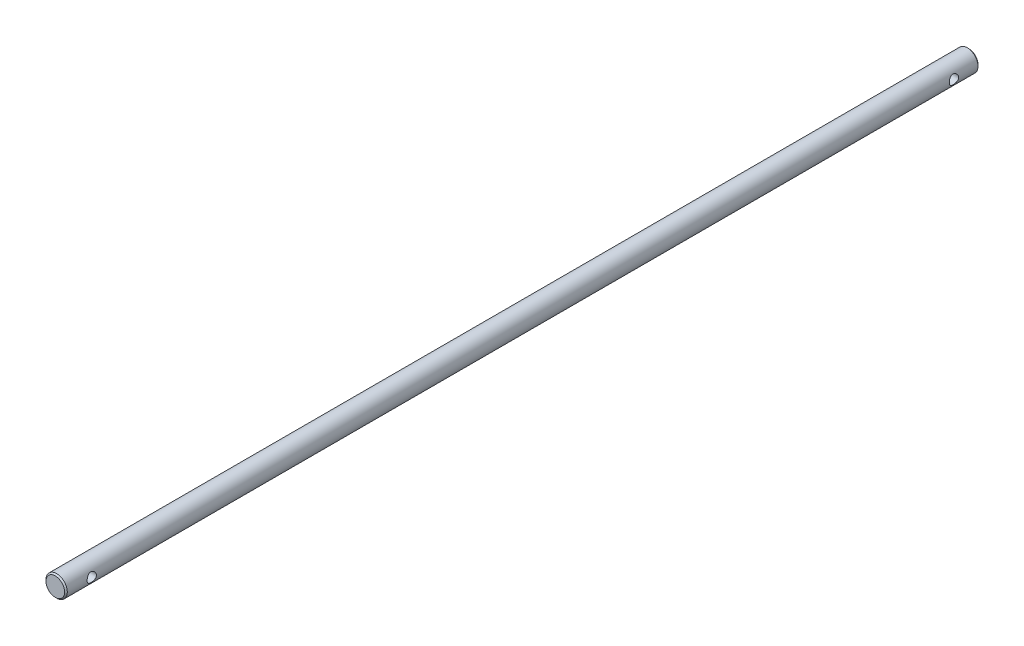
ISO-10303-21;
HEADER;
FILE_DESCRIPTION(('STEP AP214'),'2;1');
FILE_NAME('part.step','',(''),(''),'','','');
FILE_SCHEMA(('AUTOMOTIVE_DESIGN { 1 0 10303 214 1 1 1 1 }'));
ENDSEC;
DATA;
#1=APPLICATION_CONTEXT('core data for automotive mechanical design processes');
#2=APPLICATION_PROTOCOL_DEFINITION('international standard','automotive_design',2000,#1);
#3=PRODUCT_CONTEXT('',#1,'mechanical');
#4=PRODUCT('Part','Part','',(#3));
#5=PRODUCT_RELATED_PRODUCT_CATEGORY('part','',(#4));
#6=PRODUCT_DEFINITION_FORMATION('','',#4);
#7=PRODUCT_DEFINITION_CONTEXT('part definition',#1,'design');
#8=PRODUCT_DEFINITION('design','',#6,#7);
#9=PRODUCT_DEFINITION_SHAPE('','',#8);
#10=(LENGTH_UNIT() NAMED_UNIT(*) SI_UNIT(.MILLI.,.METRE.));
#11=(NAMED_UNIT(*) PLANE_ANGLE_UNIT() SI_UNIT($,.RADIAN.));
#12=(NAMED_UNIT(*) SI_UNIT($,.STERADIAN.) SOLID_ANGLE_UNIT());
#13=UNCERTAINTY_MEASURE_WITH_UNIT(LENGTH_MEASURE(1.E-05),#10,'distance_accuracy_value','');
#14=(GEOMETRIC_REPRESENTATION_CONTEXT(3) GLOBAL_UNCERTAINTY_ASSIGNED_CONTEXT((#13)) GLOBAL_UNIT_ASSIGNED_CONTEXT((#10,
#11,#12)) REPRESENTATION_CONTEXT('',''));
#15=CARTESIAN_POINT('',(0.,0.,0.));
#16=DIRECTION('',(0.,0.,1.));
#17=DIRECTION('',(1.,0.,0.));
#18=AXIS2_PLACEMENT_3D('',#15,#16,#17);
#19=CARTESIAN_POINT('',(0.,0.,342.9));
#20=DIRECTION('',(0.,0.,-1.));
#21=DIRECTION('',(-1.,0.,0.));
#22=AXIS2_PLACEMENT_3D('',#19,#20,#21);
#23=CYLINDRICAL_SURFACE('',#22,4.);
#24=CARTESIAN_POINT('',(4.,0.,334.941599310764));
#25=CARTESIAN_POINT('',(3.99999663734808,0.0934463432264823,334.941595169877));
#26=CARTESIAN_POINT('',(3.99668869061283,0.187042389155383,334.934081671393));
#27=CARTESIAN_POINT('',(3.98378594555563,0.37154938095276,334.90432190137));
#28=CARTESIAN_POINT('',(3.97417572989113,0.462453169260804,334.882039498988));
#29=CARTESIAN_POINT('',(3.94969014231534,0.638614374237538,334.823732767344));
#30=CARTESIAN_POINT('',(3.93483335927543,0.723890480122746,334.787756920114));
#31=CARTESIAN_POINT('',(3.90128118573592,0.887105743590368,334.703297788839));
#32=CARTESIAN_POINT('',(3.88258673598616,0.96504669246684,334.654817569318));
#33=CARTESIAN_POINT('',(3.84206972691249,1.11574570191128,334.543952327941));
#34=CARTESIAN_POINT('',(3.82013790368076,1.18805391807246,334.480996175083));
#35=CARTESIAN_POINT('',(3.77606108441152,1.32148009135275,334.344177573686));
#36=CARTESIAN_POINT('',(3.75391597260759,1.38259156357118,334.270308849284));
#37=CARTESIAN_POINT('',(3.71052876905718,1.49526805485836,334.108784222429));
#38=CARTESIAN_POINT('',(3.68940576522506,1.54611132769735,334.020589411492));
#39=CARTESIAN_POINT('',(3.65221182204704,1.6320408373189,333.83584617932));
#40=CARTESIAN_POINT('',(3.63613801387077,1.66713602665513,333.7393025416));
#41=CARTESIAN_POINT('',(3.6120577262251,1.71866664712584,333.545777046626));
#42=CARTESIAN_POINT('',(3.6036775125555,1.7359720830201,333.449075272899));
#43=CARTESIAN_POINT('',(3.59487244260311,1.75413945226084,333.253805679326));
#44=CARTESIAN_POINT('',(3.59444249946225,1.75501190000817,333.155239093075));
#45=CARTESIAN_POINT('',(3.60127372422886,1.74093881994997,332.968151684668));
#46=CARTESIAN_POINT('',(3.60787303256936,1.72735459831769,332.879499215632));
#47=CARTESIAN_POINT('',(3.62689055317553,1.68705543535527,332.70588905813));
#48=CARTESIAN_POINT('',(3.63931002569882,1.66033765011383,332.620932174238));
#49=CARTESIAN_POINT('',(3.66885532481444,1.59400090719573,332.454871504066));
#50=CARTESIAN_POINT('',(3.68607958480637,1.55410850482798,332.373895260988));
#51=CARTESIAN_POINT('',(3.72327669274238,1.46275071446545,332.21945003373));
#52=CARTESIAN_POINT('',(3.74325068159699,1.4112805169919,332.14598418791));
#53=CARTESIAN_POINT('',(3.78598682885878,1.29253409635271,332.001345426591));
#54=CARTESIAN_POINT('',(3.80883420348057,1.22422450595306,331.931043505931));
#55=CARTESIAN_POINT('',(3.85316789206075,1.07658489233751,331.802583138393));
#56=CARTESIAN_POINT('',(3.87465381580334,0.997251730188553,331.744428162173));
#57=CARTESIAN_POINT('',(3.91459288460572,0.82693055449578,331.640446139492));
#58=CARTESIAN_POINT('',(3.93294439394639,0.735678618728522,331.595009401124));
#59=CARTESIAN_POINT('',(3.96374936010267,0.545815738180422,331.520444313078));
#60=CARTESIAN_POINT('',(3.97620642863549,0.44720934271231,331.491305974838));
#61=CARTESIAN_POINT('',(3.99312207438418,0.252683762576196,331.452071017538));
#62=CARTESIAN_POINT('',(3.99806968465928,0.157042481856274,331.440807750357));
#63=CARTESIAN_POINT('',(4.00099761403254,-0.0348853773968451,331.434120120132));
#64=CARTESIAN_POINT('',(3.99898021161985,-0.13117173461826,331.438690577347));
#65=CARTESIAN_POINT('',(3.98851661420575,-0.315953726230852,331.462738791353));
#66=CARTESIAN_POINT('',(3.98043748431965,-0.404583359318488,331.481365723894));
#67=CARTESIAN_POINT('',(3.95907260211437,-0.577343109087928,331.531778153142));
#68=CARTESIAN_POINT('',(3.94578621082902,-0.661472672140376,331.563565264719));
#69=CARTESIAN_POINT('',(3.9147450623497,-0.825825233617224,331.640416979861));
#70=CARTESIAN_POINT('',(3.89686366362399,-0.905844044277323,331.685865401152));
#71=CARTESIAN_POINT('',(3.85849837602854,-1.05740826822764,331.788330988097));
#72=CARTESIAN_POINT('',(3.83801336265467,-1.12894999430306,331.845353158857));
#73=CARTESIAN_POINT('',(3.79463393052205,-1.26744844879856,331.974569524829));
#74=CARTESIAN_POINT('',(3.77167663119023,-1.33360392711709,332.04760352374));
#75=CARTESIAN_POINT('',(3.72732047159778,-1.45297865142874,332.204040335604));
#76=CARTESIAN_POINT('',(3.70592211633901,-1.5061937184614,332.287446485018));
#77=CARTESIAN_POINT('',(3.66679970660888,-1.59912019030095,332.464681088915));
#78=CARTESIAN_POINT('',(3.64916319235882,-1.63852130497262,332.558693051935));
#79=CARTESIAN_POINT('',(3.62067125249862,-1.70056646013738,332.753041072892));
#80=CARTESIAN_POINT('',(3.60980943404431,-1.72322630202965,332.853371070156));
#81=CARTESIAN_POINT('',(3.59714355587648,-1.74950035736323,333.048530196088));
#82=CARTESIAN_POINT('',(3.59466194542807,-1.75454048431464,333.143123825122));
#83=CARTESIAN_POINT('',(3.59720585727819,-1.74931988786869,333.331774405704));
#84=CARTESIAN_POINT('',(3.60222989587907,-1.73906218850748,333.425831459632));
#85=CARTESIAN_POINT('',(3.61857277776088,-1.70477458709946,333.605192844058));
#86=CARTESIAN_POINT('',(3.62951747350146,-1.68156089693572,333.690690767463));
#87=CARTESIAN_POINT('',(3.65613686565626,-1.62286656463062,333.856575229028));
#88=CARTESIAN_POINT('',(3.6718129199857,-1.58738240039692,333.93696029175));
#89=CARTESIAN_POINT('',(3.70735600389641,-1.50258087731124,334.0959053184));
#90=CARTESIAN_POINT('',(3.72742549356056,-1.4525301279185,334.174027748809));
#91=CARTESIAN_POINT('',(3.76899162297866,-1.34098565199573,334.321208845295));
#92=CARTESIAN_POINT('',(3.7904888346813,-1.27948732153591,334.390263845555));
#93=CARTESIAN_POINT('',(3.83465553107366,-1.14067931705401,334.523337256607));
#94=CARTESIAN_POINT('',(3.8572717668694,-1.06247534266936,334.586445099684));
#95=CARTESIAN_POINT('',(3.89935305214483,-0.895781895970826,334.698726654319));
#96=CARTESIAN_POINT('',(3.91881666761382,-0.807287774312666,334.747894032463));
#97=CARTESIAN_POINT('',(3.95220215562429,-0.623468704908329,334.830005291972));
#98=CARTESIAN_POINT('',(3.96619125147993,-0.528244750332977,334.863147229519));
#99=CARTESIAN_POINT('',(3.98731821188224,-0.332968102886718,334.912606496585));
#100=CARTESIAN_POINT('',(3.99447710395941,-0.23293123265386,334.928975475084));
#101=CARTESIAN_POINT('',(3.99854083328223,-0.110288528563413,334.938266103859));
#102=CARTESIAN_POINT('',(3.99908711675265,-0.0882552381577088,334.939514934841));
#103=CARTESIAN_POINT('',(3.99981709907305,-0.0441507512958812,334.941182031385));
#104=CARTESIAN_POINT('',(4.00000079452929,-0.0220795544868966,334.941600289175));
#105=CARTESIAN_POINT('',(4.,0.,334.941599310764));
#106=B_SPLINE_CURVE_WITH_KNOTS('',3,(#24,#25,#26,#27,#28,#29,#30,#31,#32,#33,#34,#35,#36,#37,
#38,#39,#40,#41,#42,#43,#44,#45,#46,#47,#48,#49,#50,#51,#52,#53,#54,#55,#56,#57,#58,#59,#60,#61,
#62,#63,#64,#65,#66,#67,#68,#69,#70,#71,#72,#73,#74,#75,#76,#77,#78,#79,#80,#81,#82,#83,#84,#85,
#86,#87,#88,#89,#90,#91,#92,#93,#94,#95,#96,#97,#98,#99,#100,#101,#102,#103,#104,#105),
.UNSPECIFIED.,.T.,.F.,(4,2,2,2,2,2,2,2,2,2,2,2,2,2,2,2,2,2,2,2,2,2,2,2,2,2,2,2,2,2,2,2,2,2,2,2,
2,2,2,2,4),(0.,0.280248106647614,0.561184359110114,0.841135064053392,1.121017224805,
1.41480376399849,1.70875992350557,2.01909682887037,2.32925708806895,2.62340061325386,
2.91735592872095,3.18589200546284,3.45448625601366,3.72904802807271,4.00372406589868,
4.30432716995196,4.60501604602727,4.91411519083072,5.22302469440982,5.51079411805175,
5.79846941158925,6.07000349898951,6.34157091589477,6.62162332825821,6.90179710923945,
7.20397285238564,7.50624605058368,7.81492927252933,8.12332076754671,8.40609094746911,
8.68880523749623,8.9554451370287,9.22216163596179,9.50575930383601,9.78947127496828,
10.0970191800753,10.4047065868983,10.7084874325425,11.0113300087332,11.0775465690778,
11.1437637491935),.UNSPECIFIED.);
#107=CARTESIAN_POINT('',(4.,0.,334.941599310764));
#108=VERTEX_POINT('',#107);
#109=EDGE_CURVE('E10',#108,#108,#106,.T.);
#110=ORIENTED_EDGE('',*,*,#109,.T.);
#111=EDGE_LOOP('',(#110));
#112=FACE_BOUND('',#111,.T.);
#113=CARTESIAN_POINT('',(-4.,0.,334.941599310764));
#114=CARTESIAN_POINT('',(-3.99999663734808,-0.0934463432264823,334.941595169877));
#115=CARTESIAN_POINT('',(-3.99668869061283,-0.187042389155383,334.934081671393));
#116=CARTESIAN_POINT('',(-3.98378594555563,-0.37154938095276,334.90432190137));
#117=CARTESIAN_POINT('',(-3.97417572989113,-0.462453169260804,334.882039498988));
#118=CARTESIAN_POINT('',(-3.94969014231534,-0.638614374237538,334.823732767344));
#119=CARTESIAN_POINT('',(-3.93483335927543,-0.723890480122746,334.787756920114));
#120=CARTESIAN_POINT('',(-3.90128118573592,-0.887105743590368,334.703297788839));
#121=CARTESIAN_POINT('',(-3.88258673598616,-0.96504669246684,334.654817569318));
#122=CARTESIAN_POINT('',(-3.84206972691249,-1.11574570191128,334.543952327941));
#123=CARTESIAN_POINT('',(-3.82013790368076,-1.18805391807246,334.480996175083));
#124=CARTESIAN_POINT('',(-3.77606108441152,-1.32148009135275,334.344177573686));
#125=CARTESIAN_POINT('',(-3.75391597260759,-1.38259156357118,334.270308849284));
#126=CARTESIAN_POINT('',(-3.71052876905718,-1.49526805485836,334.108784222429));
#127=CARTESIAN_POINT('',(-3.68940576522506,-1.54611132769735,334.020589411492));
#128=CARTESIAN_POINT('',(-3.65221182204704,-1.6320408373189,333.83584617932));
#129=CARTESIAN_POINT('',(-3.63613801387077,-1.66713602665513,333.7393025416));
#130=CARTESIAN_POINT('',(-3.6120577262251,-1.71866664712584,333.545777046626));
#131=CARTESIAN_POINT('',(-3.6036775125555,-1.7359720830201,333.449075272899));
#132=CARTESIAN_POINT('',(-3.59487244260311,-1.75413945226084,333.253805679326));
#133=CARTESIAN_POINT('',(-3.59444249946225,-1.75501190000817,333.155239093075));
#134=CARTESIAN_POINT('',(-3.60127372422886,-1.74093881994997,332.968151684668));
#135=CARTESIAN_POINT('',(-3.60787303256936,-1.72735459831769,332.879499215632));
#136=CARTESIAN_POINT('',(-3.62689055317553,-1.68705543535527,332.70588905813));
#137=CARTESIAN_POINT('',(-3.63931002569882,-1.66033765011383,332.620932174238));
#138=CARTESIAN_POINT('',(-3.66885532481444,-1.59400090719573,332.454871504066));
#139=CARTESIAN_POINT('',(-3.68607958480637,-1.55410850482798,332.373895260988));
#140=CARTESIAN_POINT('',(-3.72327669274238,-1.46275071446545,332.21945003373));
#141=CARTESIAN_POINT('',(-3.74325068159699,-1.4112805169919,332.14598418791));
#142=CARTESIAN_POINT('',(-3.78598682885878,-1.29253409635271,332.001345426591));
#143=CARTESIAN_POINT('',(-3.80883420348057,-1.22422450595306,331.931043505931));
#144=CARTESIAN_POINT('',(-3.85316789206075,-1.07658489233751,331.802583138393));
#145=CARTESIAN_POINT('',(-3.87465381580334,-0.997251730188553,331.744428162173));
#146=CARTESIAN_POINT('',(-3.91459288460572,-0.82693055449578,331.640446139492));
#147=CARTESIAN_POINT('',(-3.93294439394639,-0.735678618728522,331.595009401124));
#148=CARTESIAN_POINT('',(-3.96374936010267,-0.545815738180422,331.520444313078));
#149=CARTESIAN_POINT('',(-3.97620642863549,-0.44720934271231,331.491305974838));
#150=CARTESIAN_POINT('',(-3.99312207438418,-0.252683762576196,331.452071017538));
#151=CARTESIAN_POINT('',(-3.99806968465928,-0.157042481856274,331.440807750357));
#152=CARTESIAN_POINT('',(-4.00099761403254,0.0348853773968451,331.434120120132));
#153=CARTESIAN_POINT('',(-3.99898021161985,0.13117173461826,331.438690577347));
#154=CARTESIAN_POINT('',(-3.98851661420575,0.315953726230852,331.462738791353));
#155=CARTESIAN_POINT('',(-3.98043748431965,0.404583359318488,331.481365723894));
#156=CARTESIAN_POINT('',(-3.95907260211437,0.577343109087928,331.531778153142));
#157=CARTESIAN_POINT('',(-3.94578621082902,0.661472672140376,331.563565264719));
#158=CARTESIAN_POINT('',(-3.9147450623497,0.825825233617224,331.640416979861));
#159=CARTESIAN_POINT('',(-3.89686366362399,0.905844044277323,331.685865401152));
#160=CARTESIAN_POINT('',(-3.85849837602854,1.05740826822764,331.788330988097));
#161=CARTESIAN_POINT('',(-3.83801336265467,1.12894999430306,331.845353158857));
#162=CARTESIAN_POINT('',(-3.79463393052205,1.26744844879856,331.974569524829));
#163=CARTESIAN_POINT('',(-3.77167663119023,1.33360392711709,332.04760352374));
#164=CARTESIAN_POINT('',(-3.72732047159778,1.45297865142874,332.204040335604));
#165=CARTESIAN_POINT('',(-3.70592211633901,1.5061937184614,332.287446485018));
#166=CARTESIAN_POINT('',(-3.66679970660888,1.59912019030095,332.464681088915));
#167=CARTESIAN_POINT('',(-3.64916319235882,1.63852130497262,332.558693051935));
#168=CARTESIAN_POINT('',(-3.62067125249862,1.70056646013738,332.753041072892));
#169=CARTESIAN_POINT('',(-3.60980943404431,1.72322630202965,332.853371070156));
#170=CARTESIAN_POINT('',(-3.59714355587648,1.74950035736323,333.048530196088));
#171=CARTESIAN_POINT('',(-3.59466194542807,1.75454048431464,333.143123825122));
#172=CARTESIAN_POINT('',(-3.59720585727819,1.74931988786869,333.331774405704));
#173=CARTESIAN_POINT('',(-3.60222989587907,1.73906218850748,333.425831459632));
#174=CARTESIAN_POINT('',(-3.61857277776088,1.70477458709946,333.605192844058));
#175=CARTESIAN_POINT('',(-3.62951747350146,1.68156089693572,333.690690767463));
#176=CARTESIAN_POINT('',(-3.65613686565626,1.62286656463062,333.856575229028));
#177=CARTESIAN_POINT('',(-3.6718129199857,1.58738240039692,333.93696029175));
#178=CARTESIAN_POINT('',(-3.70735600389641,1.50258087731124,334.0959053184));
#179=CARTESIAN_POINT('',(-3.72742549356056,1.4525301279185,334.174027748809));
#180=CARTESIAN_POINT('',(-3.76899162297866,1.34098565199573,334.321208845295));
#181=CARTESIAN_POINT('',(-3.7904888346813,1.27948732153591,334.390263845555));
#182=CARTESIAN_POINT('',(-3.83465553107366,1.14067931705401,334.523337256607));
#183=CARTESIAN_POINT('',(-3.8572717668694,1.06247534266936,334.586445099684));
#184=CARTESIAN_POINT('',(-3.89935305214483,0.895781895970826,334.698726654319));
#185=CARTESIAN_POINT('',(-3.91881666761382,0.807287774312666,334.747894032463));
#186=CARTESIAN_POINT('',(-3.95220215562429,0.623468704908329,334.830005291972));
#187=CARTESIAN_POINT('',(-3.96619125147993,0.528244750332977,334.863147229519));
#188=CARTESIAN_POINT('',(-3.98731821188224,0.332968102886718,334.912606496585));
#189=CARTESIAN_POINT('',(-3.99447710395941,0.23293123265386,334.928975475084));
#190=CARTESIAN_POINT('',(-3.99854083328223,0.110288528563413,334.938266103859));
#191=CARTESIAN_POINT('',(-3.99908711675265,0.0882552381577088,334.939514934841));
#192=CARTESIAN_POINT('',(-3.99981709907305,0.0441507512958812,334.941182031385));
#193=CARTESIAN_POINT('',(-4.00000079452929,0.0220795544868966,334.941600289175));
#194=CARTESIAN_POINT('',(-4.,0.,334.941599310764));
#195=B_SPLINE_CURVE_WITH_KNOTS('',3,(#113,#114,#115,#116,#117,#118,#119,#120,#121,#122,#123,
#124,#125,#126,#127,#128,#129,#130,#131,#132,#133,#134,#135,#136,#137,#138,#139,#140,#141,#142,
#143,#144,#145,#146,#147,#148,#149,#150,#151,#152,#153,#154,#155,#156,#157,#158,#159,#160,#161,
#162,#163,#164,#165,#166,#167,#168,#169,#170,#171,#172,#173,#174,#175,#176,#177,#178,#179,#180,
#181,#182,#183,#184,#185,#186,#187,#188,#189,#190,#191,#192,#193,#194),.UNSPECIFIED.,.T.,.F.,(4,
2,2,2,2,2,2,2,2,2,2,2,2,2,2,2,2,2,2,2,2,2,2,2,2,2,2,2,2,2,2,2,2,2,2,2,2,2,2,2,4),(0.,
0.280248106647614,0.561184359110114,0.841135064053392,1.121017224805,1.41480376399849,
1.70875992350557,2.01909682887037,2.32925708806895,2.62340061325386,2.91735592872095,
3.18589200546284,3.45448625601366,3.72904802807271,4.00372406589868,4.30432716995196,
4.60501604602727,4.91411519083072,5.22302469440982,5.51079411805175,5.79846941158925,
6.07000349898951,6.34157091589477,6.62162332825821,6.90179710923945,7.20397285238564,
7.50624605058368,7.81492927252933,8.12332076754671,8.40609094746911,8.68880523749623,
8.9554451370287,9.22216163596179,9.50575930383601,9.78947127496828,10.0970191800753,
10.4047065868983,10.7084874325425,11.0113300087332,11.0775465690778,11.1437637491935),.UNSPECIFIED.);
#196=CARTESIAN_POINT('',(-4.,0.,334.941599310764));
#197=VERTEX_POINT('',#196);
#198=EDGE_CURVE('E41',#197,#197,#195,.T.);
#199=ORIENTED_EDGE('',*,*,#198,.T.);
#200=EDGE_LOOP('',(#199));
#201=FACE_BOUND('',#200,.T.);
#202=CARTESIAN_POINT('',(4.,0.,11.2776));
#203=CARTESIAN_POINT('',(3.99999663734808,0.0934463432264808,11.2775958591135));
#204=CARTESIAN_POINT('',(3.99668869061283,0.187042389155376,11.2700823606289));
#205=CARTESIAN_POINT('',(3.98378594555563,0.371549380952751,11.2403225906058));
#206=CARTESIAN_POINT('',(3.97417572989113,0.462453169260797,11.2180401882246));
#207=CARTESIAN_POINT('',(3.94969014231534,0.638614374237526,11.1597334565802));
#208=CARTESIAN_POINT('',(3.93483335927543,0.723890480122727,11.1237576093504));
#209=CARTESIAN_POINT('',(3.90128118573592,0.88710574359034,11.0392984780748));
#210=CARTESIAN_POINT('',(3.88258673598617,0.965046692466811,10.990818258554));
#211=CARTESIAN_POINT('',(3.8420697269125,1.11574570191126,10.8799530171768));
#212=CARTESIAN_POINT('',(3.82013790368077,1.18805391807245,10.8169968643188));
#213=CARTESIAN_POINT('',(3.77606108441153,1.32148009135273,10.680178262922));
#214=CARTESIAN_POINT('',(3.7539159726076,1.38259156357116,10.6063095385207));
#215=CARTESIAN_POINT('',(3.7105287690572,1.49526805485832,10.444784911665));
#216=CARTESIAN_POINT('',(3.68940576522507,1.54611132769732,10.3565901007285));
#217=CARTESIAN_POINT('',(3.65221182204705,1.63204083731887,10.1718468685567));
#218=CARTESIAN_POINT('',(3.63613801387078,1.6671360266551,10.075303230836));
#219=CARTESIAN_POINT('',(3.61205772622511,1.71866664712581,9.88177773586234));
#220=CARTESIAN_POINT('',(3.60367751255551,1.73597208302007,9.78507596213499));
#221=CARTESIAN_POINT('',(3.59487244260312,1.75413945226082,9.58980636856261));
#222=CARTESIAN_POINT('',(3.59444249946227,1.75501190000814,9.49123978231109));
#223=CARTESIAN_POINT('',(3.60127372422887,1.74093881994994,9.30415237390443));
#224=CARTESIAN_POINT('',(3.60787303256937,1.72735459831766,9.21549990486794));
#225=CARTESIAN_POINT('',(3.62689055317554,1.68705543535525,9.04188974736672));
#226=CARTESIAN_POINT('',(3.63931002569883,1.66033765011381,8.9569328634743));
#227=CARTESIAN_POINT('',(3.66885532481445,1.59400090719571,8.79087219330255));
#228=CARTESIAN_POINT('',(3.68607958480638,1.55410850482796,8.70989595022403));
#229=CARTESIAN_POINT('',(3.72327669274239,1.46275071446542,8.55545072296638));
#230=CARTESIAN_POINT('',(3.743250681597,1.41128051699188,8.48198487714653));
#231=CARTESIAN_POINT('',(3.78598682885879,1.29253409635268,8.33734611582737));
#232=CARTESIAN_POINT('',(3.80883420348058,1.22422450595303,8.2670441951674));
#233=CARTESIAN_POINT('',(3.85316789206076,1.0765848923375,8.13858382762903));
#234=CARTESIAN_POINT('',(3.87465381580334,0.997251730188544,8.08042885140952));
#235=CARTESIAN_POINT('',(3.91459288460572,0.82693055449578,7.97644682872834));
#236=CARTESIAN_POINT('',(3.93294439394639,0.73567861872852,7.93101009036012));
#237=CARTESIAN_POINT('',(3.96374936010267,0.545815738180419,7.85644500231462));
#238=CARTESIAN_POINT('',(3.97620642863549,0.44720934271231,7.82730666407454));
#239=CARTESIAN_POINT('',(3.99312207438418,0.252683762576199,7.78807170677463));
#240=CARTESIAN_POINT('',(3.99806968465928,0.157042481856278,7.77680843959345));
#241=CARTESIAN_POINT('',(4.00099761403254,-0.0348853773968423,7.77012080936784));
#242=CARTESIAN_POINT('',(3.99898021161985,-0.131171734618259,7.77469126658304));
#243=CARTESIAN_POINT('',(3.98851661420575,-0.315953726230854,7.79873948058904));
#244=CARTESIAN_POINT('',(3.98043748431965,-0.40458335931849,7.81736641312984));
#245=CARTESIAN_POINT('',(3.95907260211437,-0.577343109087927,7.86777884237817));
#246=CARTESIAN_POINT('',(3.94578621082902,-0.661472672140372,7.8995659539556));
#247=CARTESIAN_POINT('',(3.9147450623497,-0.82582523361721,7.97641766909741));
#248=CARTESIAN_POINT('',(3.89686366362399,-0.905844044277302,8.02186609038844));
#249=CARTESIAN_POINT('',(3.85849837602855,-1.05740826822762,8.12433167733357));
#250=CARTESIAN_POINT('',(3.83801336265467,-1.12894999430305,8.1813538480936));
#251=CARTESIAN_POINT('',(3.79463393052205,-1.26744844879854,8.31057021406512));
#252=CARTESIAN_POINT('',(3.77167663119024,-1.33360392711707,8.3836042129766));
#253=CARTESIAN_POINT('',(3.72732047159779,-1.45297865142871,8.54004102484014));
#254=CARTESIAN_POINT('',(3.70592211633901,-1.50619371846138,8.62344717425401));
#255=CARTESIAN_POINT('',(3.66679970660889,-1.59912019030094,8.80068177815102));
#256=CARTESIAN_POINT('',(3.64916319235883,-1.6385213049726,8.89469374117111));
#257=CARTESIAN_POINT('',(3.62067125249863,-1.70056646013735,9.08904176212824));
#258=CARTESIAN_POINT('',(3.60980943404432,-1.72322630202963,9.18937175939226));
#259=CARTESIAN_POINT('',(3.59714355587649,-1.7495003573632,9.38453088532466));
#260=CARTESIAN_POINT('',(3.59466194542809,-1.75454048431461,9.47912451435857));
#261=CARTESIAN_POINT('',(3.59720585727821,-1.74931988786866,9.66777509494079));
#262=CARTESIAN_POINT('',(3.60222989587909,-1.73906218850744,9.76183214886872));
#263=CARTESIAN_POINT('',(3.61857277776089,-1.70477458709943,9.94119353329461));
#264=CARTESIAN_POINT('',(3.62951747350147,-1.6815608969357,10.0266914566997));
#265=CARTESIAN_POINT('',(3.65613686565627,-1.6228665646306,10.1925759182639));
#266=CARTESIAN_POINT('',(3.67181291998571,-1.58738240039689,10.2729609809858));
#267=CARTESIAN_POINT('',(3.70735600389643,-1.5025808773112,10.4319060076366));
#268=CARTESIAN_POINT('',(3.72742549356057,-1.45253012791847,10.5100284380455));
#269=CARTESIAN_POINT('',(3.76899162297867,-1.3409856519957,10.657209534531));
#270=CARTESIAN_POINT('',(3.79048883468131,-1.27948732153587,10.7262645347916));
#271=CARTESIAN_POINT('',(3.83465553107367,-1.14067931705397,10.8593379458437));
#272=CARTESIAN_POINT('',(3.85727176686941,-1.06247534266933,10.92244578892));
#273=CARTESIAN_POINT('',(3.89935305214484,-0.895781895970805,11.0347273435551));
#274=CARTESIAN_POINT('',(3.91881666761382,-0.807287774312648,11.0838947216989));
#275=CARTESIAN_POINT('',(3.95220215562429,-0.62346870490831,11.1660059812086));
#276=CARTESIAN_POINT('',(3.96619125147993,-0.528244750332953,11.1991479187555));
#277=CARTESIAN_POINT('',(3.98731821188225,-0.332968102886687,11.2486071858208));
#278=CARTESIAN_POINT('',(3.99447710395941,-0.232931232653826,11.2649761643204));
#279=CARTESIAN_POINT('',(3.99854083328223,-0.110288528563389,11.2742667930951));
#280=CARTESIAN_POINT('',(3.99908711675265,-0.0882552381576912,11.2755156240768));
#281=CARTESIAN_POINT('',(3.99981709907305,-0.0441507512958734,11.2771827206217));
#282=CARTESIAN_POINT('',(4.00000079452929,-0.0220795544868926,11.277600978411));
#283=CARTESIAN_POINT('',(4.,0.,11.2776));
#284=B_SPLINE_CURVE_WITH_KNOTS('',3,(#202,#203,#204,#205,#206,#207,#208,#209,#210,#211,#212,
#213,#214,#215,#216,#217,#218,#219,#220,#221,#222,#223,#224,#225,#226,#227,#228,#229,#230,#231,
#232,#233,#234,#235,#236,#237,#238,#239,#240,#241,#242,#243,#244,#245,#246,#247,#248,#249,#250,
#251,#252,#253,#254,#255,#256,#257,#258,#259,#260,#261,#262,#263,#264,#265,#266,#267,#268,#269,
#270,#271,#272,#273,#274,#275,#276,#277,#278,#279,#280,#281,#282,#283),.UNSPECIFIED.,.T.,.F.,(4,
2,2,2,2,2,2,2,2,2,2,2,2,2,2,2,2,2,2,2,2,2,2,2,2,2,2,2,2,2,2,2,2,2,2,2,2,2,2,2,4),(0.,
0.280248106647604,0.5611843591101,0.841135064053378,1.12101722480497,1.41480376399847,
1.70875992350553,2.01909682887031,2.32925708806891,2.62340061325385,2.91735592872091,
3.18589200546279,3.4544862560136,3.72904802807259,4.00372406589862,4.30432716995191,
4.60501604602716,4.91411519083063,5.2230246944097,5.51079411805165,5.79846941158915,
6.0700034989894,6.34157091589466,6.62162332825809,6.90179710923933,7.20397285238553,
7.50624605058354,7.81492927252924,8.12332076754658,8.40609094746898,8.68880523749612,
8.95544513702853,9.22216163596164,9.50575930383588,9.78947127496812,10.0970191800752,
10.4047065868981,10.7084874325424,11.0113300087331,11.0775465690776,11.1437637491933),.UNSPECIFIED.);
#285=CARTESIAN_POINT('',(4.,0.,11.2776));
#286=VERTEX_POINT('',#285);
#287=EDGE_CURVE('E45',#286,#286,#284,.T.);
#288=ORIENTED_EDGE('',*,*,#287,.T.);
#289=EDGE_LOOP('',(#288));
#290=FACE_BOUND('',#289,.T.);
#291=CARTESIAN_POINT('',(-4.,0.,11.2776));
#292=CARTESIAN_POINT('',(-3.99999663734808,-0.0934463432264808,11.2775958591135));
#293=CARTESIAN_POINT('',(-3.99668869061283,-0.187042389155376,11.2700823606289));
#294=CARTESIAN_POINT('',(-3.98378594555563,-0.371549380952751,11.2403225906058));
#295=CARTESIAN_POINT('',(-3.97417572989113,-0.462453169260797,11.2180401882246));
#296=CARTESIAN_POINT('',(-3.94969014231534,-0.638614374237526,11.1597334565802));
#297=CARTESIAN_POINT('',(-3.93483335927543,-0.723890480122727,11.1237576093504));
#298=CARTESIAN_POINT('',(-3.90128118573592,-0.88710574359034,11.0392984780748));
#299=CARTESIAN_POINT('',(-3.88258673598617,-0.965046692466811,10.990818258554));
#300=CARTESIAN_POINT('',(-3.8420697269125,-1.11574570191126,10.8799530171768));
#301=CARTESIAN_POINT('',(-3.82013790368077,-1.18805391807245,10.8169968643188));
#302=CARTESIAN_POINT('',(-3.77606108441153,-1.32148009135273,10.680178262922));
#303=CARTESIAN_POINT('',(-3.7539159726076,-1.38259156357116,10.6063095385207));
#304=CARTESIAN_POINT('',(-3.7105287690572,-1.49526805485832,10.444784911665));
#305=CARTESIAN_POINT('',(-3.68940576522507,-1.54611132769732,10.3565901007285));
#306=CARTESIAN_POINT('',(-3.65221182204705,-1.63204083731887,10.1718468685567));
#307=CARTESIAN_POINT('',(-3.63613801387078,-1.6671360266551,10.075303230836));
#308=CARTESIAN_POINT('',(-3.61205772622511,-1.71866664712581,9.88177773586234));
#309=CARTESIAN_POINT('',(-3.60367751255551,-1.73597208302007,9.78507596213499));
#310=CARTESIAN_POINT('',(-3.59487244260312,-1.75413945226082,9.58980636856261));
#311=CARTESIAN_POINT('',(-3.59444249946227,-1.75501190000814,9.49123978231109));
#312=CARTESIAN_POINT('',(-3.60127372422887,-1.74093881994994,9.30415237390443));
#313=CARTESIAN_POINT('',(-3.60787303256937,-1.72735459831766,9.21549990486794));
#314=CARTESIAN_POINT('',(-3.62689055317554,-1.68705543535525,9.04188974736672));
#315=CARTESIAN_POINT('',(-3.63931002569883,-1.66033765011381,8.9569328634743));
#316=CARTESIAN_POINT('',(-3.66885532481445,-1.59400090719571,8.79087219330255));
#317=CARTESIAN_POINT('',(-3.68607958480638,-1.55410850482796,8.70989595022403));
#318=CARTESIAN_POINT('',(-3.72327669274239,-1.46275071446542,8.55545072296638));
#319=CARTESIAN_POINT('',(-3.743250681597,-1.41128051699188,8.48198487714653));
#320=CARTESIAN_POINT('',(-3.78598682885879,-1.29253409635268,8.33734611582737));
#321=CARTESIAN_POINT('',(-3.80883420348058,-1.22422450595303,8.2670441951674));
#322=CARTESIAN_POINT('',(-3.85316789206076,-1.0765848923375,8.13858382762903));
#323=CARTESIAN_POINT('',(-3.87465381580334,-0.997251730188544,8.08042885140952));
#324=CARTESIAN_POINT('',(-3.91459288460572,-0.82693055449578,7.97644682872834));
#325=CARTESIAN_POINT('',(-3.93294439394639,-0.73567861872852,7.93101009036012));
#326=CARTESIAN_POINT('',(-3.96374936010267,-0.545815738180419,7.85644500231462));
#327=CARTESIAN_POINT('',(-3.97620642863549,-0.44720934271231,7.82730666407454));
#328=CARTESIAN_POINT('',(-3.99312207438418,-0.252683762576199,7.78807170677463));
#329=CARTESIAN_POINT('',(-3.99806968465928,-0.157042481856278,7.77680843959345));
#330=CARTESIAN_POINT('',(-4.00099761403254,0.0348853773968423,7.77012080936784));
#331=CARTESIAN_POINT('',(-3.99898021161985,0.131171734618259,7.77469126658304));
#332=CARTESIAN_POINT('',(-3.98851661420575,0.315953726230854,7.79873948058904));
#333=CARTESIAN_POINT('',(-3.98043748431965,0.40458335931849,7.81736641312984));
#334=CARTESIAN_POINT('',(-3.95907260211437,0.577343109087927,7.86777884237817));
#335=CARTESIAN_POINT('',(-3.94578621082902,0.661472672140372,7.8995659539556));
#336=CARTESIAN_POINT('',(-3.9147450623497,0.82582523361721,7.97641766909741));
#337=CARTESIAN_POINT('',(-3.89686366362399,0.905844044277302,8.02186609038844));
#338=CARTESIAN_POINT('',(-3.85849837602855,1.05740826822762,8.12433167733357));
#339=CARTESIAN_POINT('',(-3.83801336265467,1.12894999430305,8.1813538480936));
#340=CARTESIAN_POINT('',(-3.79463393052205,1.26744844879854,8.31057021406512));
#341=CARTESIAN_POINT('',(-3.77167663119024,1.33360392711707,8.3836042129766));
#342=CARTESIAN_POINT('',(-3.72732047159779,1.45297865142871,8.54004102484014));
#343=CARTESIAN_POINT('',(-3.70592211633901,1.50619371846138,8.62344717425401));
#344=CARTESIAN_POINT('',(-3.66679970660889,1.59912019030094,8.80068177815102));
#345=CARTESIAN_POINT('',(-3.64916319235883,1.6385213049726,8.89469374117111));
#346=CARTESIAN_POINT('',(-3.62067125249863,1.70056646013735,9.08904176212824));
#347=CARTESIAN_POINT('',(-3.60980943404432,1.72322630202963,9.18937175939226));
#348=CARTESIAN_POINT('',(-3.59714355587649,1.7495003573632,9.38453088532466));
#349=CARTESIAN_POINT('',(-3.59466194542809,1.75454048431461,9.47912451435857));
#350=CARTESIAN_POINT('',(-3.59720585727821,1.74931988786866,9.66777509494079));
#351=CARTESIAN_POINT('',(-3.60222989587909,1.73906218850744,9.76183214886872));
#352=CARTESIAN_POINT('',(-3.61857277776089,1.70477458709943,9.94119353329461));
#353=CARTESIAN_POINT('',(-3.62951747350147,1.6815608969357,10.0266914566997));
#354=CARTESIAN_POINT('',(-3.65613686565627,1.6228665646306,10.1925759182639));
#355=CARTESIAN_POINT('',(-3.67181291998571,1.58738240039689,10.2729609809858));
#356=CARTESIAN_POINT('',(-3.70735600389643,1.5025808773112,10.4319060076366));
#357=CARTESIAN_POINT('',(-3.72742549356057,1.45253012791847,10.5100284380455));
#358=CARTESIAN_POINT('',(-3.76899162297867,1.3409856519957,10.657209534531));
#359=CARTESIAN_POINT('',(-3.79048883468131,1.27948732153587,10.7262645347916));
#360=CARTESIAN_POINT('',(-3.83465553107367,1.14067931705397,10.8593379458437));
#361=CARTESIAN_POINT('',(-3.85727176686941,1.06247534266933,10.92244578892));
#362=CARTESIAN_POINT('',(-3.89935305214484,0.895781895970805,11.0347273435551));
#363=CARTESIAN_POINT('',(-3.91881666761382,0.807287774312648,11.0838947216989));
#364=CARTESIAN_POINT('',(-3.95220215562429,0.62346870490831,11.1660059812086));
#365=CARTESIAN_POINT('',(-3.96619125147993,0.528244750332953,11.1991479187555));
#366=CARTESIAN_POINT('',(-3.98731821188225,0.332968102886687,11.2486071858208));
#367=CARTESIAN_POINT('',(-3.99447710395941,0.232931232653826,11.2649761643204));
#368=CARTESIAN_POINT('',(-3.99854083328223,0.110288528563389,11.2742667930951));
#369=CARTESIAN_POINT('',(-3.99908711675265,0.0882552381576912,11.2755156240768));
#370=CARTESIAN_POINT('',(-3.99981709907305,0.0441507512958734,11.2771827206217));
#371=CARTESIAN_POINT('',(-4.00000079452929,0.0220795544868926,11.277600978411));
#372=CARTESIAN_POINT('',(-4.,0.,11.2776));
#373=B_SPLINE_CURVE_WITH_KNOTS('',3,(#291,#292,#293,#294,#295,#296,#297,#298,#299,#300,#301,
#302,#303,#304,#305,#306,#307,#308,#309,#310,#311,#312,#313,#314,#315,#316,#317,#318,#319,#320,
#321,#322,#323,#324,#325,#326,#327,#328,#329,#330,#331,#332,#333,#334,#335,#336,#337,#338,#339,
#340,#341,#342,#343,#344,#345,#346,#347,#348,#349,#350,#351,#352,#353,#354,#355,#356,#357,#358,
#359,#360,#361,#362,#363,#364,#365,#366,#367,#368,#369,#370,#371,#372),.UNSPECIFIED.,.T.,.F.,(4,
2,2,2,2,2,2,2,2,2,2,2,2,2,2,2,2,2,2,2,2,2,2,2,2,2,2,2,2,2,2,2,2,2,2,2,2,2,2,2,4),(0.,
0.280248106647604,0.5611843591101,0.841135064053378,1.12101722480497,1.41480376399847,
1.70875992350553,2.01909682887031,2.32925708806891,2.62340061325385,2.91735592872091,
3.18589200546279,3.4544862560136,3.72904802807259,4.00372406589862,4.30432716995191,
4.60501604602716,4.91411519083063,5.2230246944097,5.51079411805165,5.79846941158915,
6.0700034989894,6.34157091589466,6.62162332825809,6.90179710923933,7.20397285238553,
7.50624605058354,7.81492927252924,8.12332076754658,8.40609094746898,8.68880523749612,
8.95544513702853,9.22216163596164,9.50575930383588,9.78947127496812,10.0970191800752,
10.4047065868981,10.7084874325424,11.0113300087331,11.0775465690776,11.1437637491933),.UNSPECIFIED.);
#374=CARTESIAN_POINT('',(-4.,0.,11.2776));
#375=VERTEX_POINT('',#374);
#376=EDGE_CURVE('E49',#375,#375,#373,.T.);
#377=ORIENTED_EDGE('',*,*,#376,.T.);
#378=EDGE_LOOP('',(#377));
#379=FACE_BOUND('',#378,.T.);
#380=CARTESIAN_POINT('',(0.,0.,0.499999999888034));
#381=DIRECTION('',(0.,0.,1.));
#382=DIRECTION('',(1.,0.,0.));
#383=AXIS2_PLACEMENT_3D('',#380,#381,#382);
#384=CIRCLE('',#383,4.);
#385=CARTESIAN_POINT('',(4.,0.,0.499999999888034));
#386=VERTEX_POINT('',#385);
#387=EDGE_CURVE('E81',#386,#386,#384,.T.);
#388=ORIENTED_EDGE('',*,*,#387,.T.);
#389=EDGE_LOOP('',(#388));
#390=FACE_BOUND('',#389,.T.);
#391=CARTESIAN_POINT('',(0.,0.,342.4));
#392=DIRECTION('',(0.,0.,1.));
#393=DIRECTION('',(1.,0.,0.));
#394=AXIS2_PLACEMENT_3D('',#391,#392,#393);
#395=CIRCLE('',#394,4.);
#396=CARTESIAN_POINT('',(4.,0.,342.4));
#397=VERTEX_POINT('',#396);
#398=EDGE_CURVE('E84',#397,#397,#395,.F.);
#399=ORIENTED_EDGE('',*,*,#398,.T.);
#400=EDGE_LOOP('',(#399));
#401=FACE_BOUND('',#400,.T.);
#402=ADVANCED_FACE('F30',(#112,#201,#290,#379,#390,#401),#23,.T.);
#403=CARTESIAN_POINT('',(0.,0.,342.9));
#404=DIRECTION('',(0.,0.,1.));
#405=DIRECTION('',(1.,0.,0.));
#406=AXIS2_PLACEMENT_3D('',#403,#404,#405);
#407=PLANE('',#406);
#408=CARTESIAN_POINT('',(0.,0.,342.9));
#409=DIRECTION('',(0.,0.,1.));
#410=DIRECTION('',(1.,0.,0.));
#411=AXIS2_PLACEMENT_3D('',#408,#409,#410);
#412=CIRCLE('',#411,3.50000000011189);
#413=CARTESIAN_POINT('',(3.50000000011189,0.,342.9));
#414=VERTEX_POINT('',#413);
#415=EDGE_CURVE('E75',#414,#414,#412,.T.);
#416=ORIENTED_EDGE('',*,*,#415,.T.);
#417=EDGE_LOOP('',(#416));
#418=FACE_BOUND('',#417,.T.);
#419=ADVANCED_FACE('F69',(#418),#407,.T.);
#420=CARTESIAN_POINT('',(0.,0.,0.));
#421=DIRECTION('',(0.,0.,1.));
#422=DIRECTION('',(1.,0.,0.));
#423=AXIS2_PLACEMENT_3D('',#420,#421,#422);
#424=PLANE('',#423);
#425=CARTESIAN_POINT('',(0.,0.,0.));
#426=DIRECTION('',(0.,0.,1.));
#427=DIRECTION('',(1.,0.,0.));
#428=AXIS2_PLACEMENT_3D('',#425,#426,#427);
#429=CIRCLE('',#428,3.50000000000003);
#430=CARTESIAN_POINT('',(3.50000000000003,0.,0.));
#431=VERTEX_POINT('',#430);
#432=EDGE_CURVE('E78',#431,#431,#429,.F.);
#433=ORIENTED_EDGE('',*,*,#432,.T.);
#434=EDGE_LOOP('',(#433));
#435=FACE_BOUND('',#434,.T.);
#436=ADVANCED_FACE('F95',(#435),#424,.F.);
#437=CARTESIAN_POINT('',(0.,0.,0.499999999888034));
#438=DIRECTION('',(0.,0.,1.));
#439=DIRECTION('',(1.,0.,0.));
#440=AXIS2_PLACEMENT_3D('',#437,#438,#439);
#441=CONICAL_SURFACE('',#440,4.,0.785398163509382);
#442=ORIENTED_EDGE('',*,*,#432,.F.);
#443=EDGE_LOOP('',(#442));
#444=FACE_BOUND('',#443,.T.);
#445=ORIENTED_EDGE('',*,*,#387,.F.);
#446=EDGE_LOOP('',(#445));
#447=FACE_BOUND('',#446,.T.);
#448=ADVANCED_FACE('F91',(#444,#447),#441,.T.);
#449=CARTESIAN_POINT('',(0.,0.,342.9));
#450=DIRECTION('',(0.,0.,-1.));
#451=DIRECTION('',(-1.,0.,0.));
#452=AXIS2_PLACEMENT_3D('',#449,#450,#451);
#453=CONICAL_SURFACE('',#452,3.50000000011189,0.785398163285561);
#454=ORIENTED_EDGE('',*,*,#398,.F.);
#455=EDGE_LOOP('',(#454));
#456=FACE_BOUND('',#455,.T.);
#457=ORIENTED_EDGE('',*,*,#415,.F.);
#458=EDGE_LOOP('',(#457));
#459=FACE_BOUND('',#458,.T.);
#460=ADVANCED_FACE('F32',(#456,#459),#453,.T.);
#461=CARTESIAN_POINT('',(4.,0.,9.525));
#462=DIRECTION('',(-1.,0.,0.));
#463=DIRECTION('',(0.,0.,1.));
#464=AXIS2_PLACEMENT_3D('',#461,#462,#463);
#465=CYLINDRICAL_SURFACE('',#464,1.7526);
#466=ORIENTED_EDGE('',*,*,#376,.F.);
#467=EDGE_LOOP('',(#466));
#468=FACE_BOUND('',#467,.T.);
#469=ORIENTED_EDGE('',*,*,#287,.F.);
#470=EDGE_LOOP('',(#469));
#471=FACE_BOUND('',#470,.T.);
#472=ADVANCED_FACE('F62',(#468,#471),#465,.F.);
#473=CARTESIAN_POINT('',(4.,0.,333.188999310764));
#474=DIRECTION('',(-1.,0.,0.));
#475=DIRECTION('',(0.,0.,1.));
#476=AXIS2_PLACEMENT_3D('',#473,#474,#475);
#477=CYLINDRICAL_SURFACE('',#476,1.75260000000003);
#478=ORIENTED_EDGE('',*,*,#198,.F.);
#479=EDGE_LOOP('',(#478));
#480=FACE_BOUND('',#479,.T.);
#481=ORIENTED_EDGE('',*,*,#109,.F.);
#482=EDGE_LOOP('',(#481));
#483=FACE_BOUND('',#482,.T.);
#484=ADVANCED_FACE('F59',(#480,#483),#477,.F.);
#485=CLOSED_SHELL('',(#402,#419,#436,#448,#460,#472,#484));
#486=MANIFOLD_SOLID_BREP('B2',#485);
#487=ADVANCED_BREP_SHAPE_REPRESENTATION('',(#18,#486),#14);
#488=SHAPE_DEFINITION_REPRESENTATION(#9,#487);
ENDSEC;
END-ISO-10303-21;
